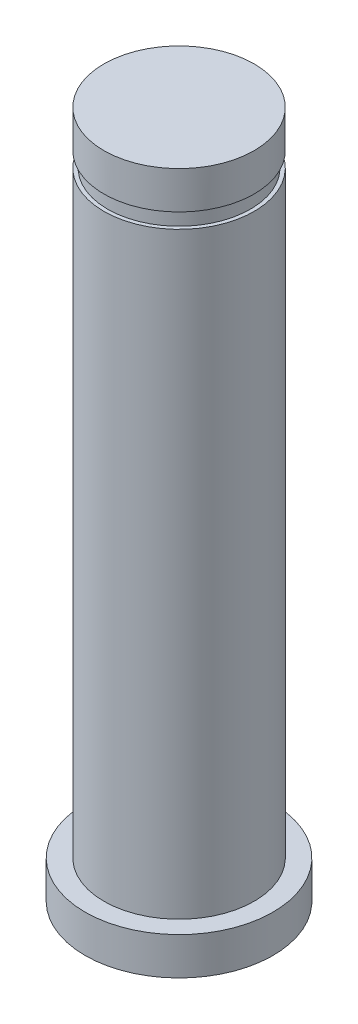
ISO-10303-21;
HEADER;
FILE_DESCRIPTION(('STEP AP214'),'2;1');
FILE_NAME('part.step','',(''),(''),'','','');
FILE_SCHEMA(('AUTOMOTIVE_DESIGN { 1 0 10303 214 1 1 1 1 }'));
ENDSEC;
DATA;
#1=APPLICATION_CONTEXT('core data for automotive mechanical design processes');
#2=APPLICATION_PROTOCOL_DEFINITION('international standard','automotive_design',2000,#1);
#3=PRODUCT_CONTEXT('',#1,'mechanical');
#4=PRODUCT('Part','Part','',(#3));
#5=PRODUCT_RELATED_PRODUCT_CATEGORY('part','',(#4));
#6=PRODUCT_DEFINITION_FORMATION('','',#4);
#7=PRODUCT_DEFINITION_CONTEXT('part definition',#1,'design');
#8=PRODUCT_DEFINITION('design','',#6,#7);
#9=PRODUCT_DEFINITION_SHAPE('','',#8);
#10=(LENGTH_UNIT() NAMED_UNIT(*) SI_UNIT(.MILLI.,.METRE.));
#11=(NAMED_UNIT(*) PLANE_ANGLE_UNIT() SI_UNIT($,.RADIAN.));
#12=(NAMED_UNIT(*) SI_UNIT($,.STERADIAN.) SOLID_ANGLE_UNIT());
#13=UNCERTAINTY_MEASURE_WITH_UNIT(LENGTH_MEASURE(1.E-05),#10,'distance_accuracy_value','');
#14=(GEOMETRIC_REPRESENTATION_CONTEXT(3) GLOBAL_UNCERTAINTY_ASSIGNED_CONTEXT((#13)) GLOBAL_UNIT_ASSIGNED_CONTEXT((#10,
#11,#12)) REPRESENTATION_CONTEXT('',''));
#15=CARTESIAN_POINT('',(0.,0.,0.));
#16=DIRECTION('',(0.,0.,1.));
#17=DIRECTION('',(1.,0.,0.));
#18=AXIS2_PLACEMENT_3D('',#15,#16,#17);
#19=CARTESIAN_POINT('',(0.,36.6,0.));
#20=DIRECTION('',(0.,-1.,0.));
#21=DIRECTION('',(0.,0.,-1.));
#22=AXIS2_PLACEMENT_3D('',#19,#20,#21);
#23=CYLINDRICAL_SURFACE('',#22,4.);
#24=CARTESIAN_POINT('',(0.,2.,0.));
#25=DIRECTION('',(0.,1.,0.));
#26=DIRECTION('',(0.,0.,1.));
#27=AXIS2_PLACEMENT_3D('',#24,#25,#26);
#28=CIRCLE('',#27,4.);
#29=CARTESIAN_POINT('',(0.,2.,4.));
#30=VERTEX_POINT('',#29);
#31=EDGE_CURVE('E10',#30,#30,#28,.T.);
#32=ORIENTED_EDGE('',*,*,#31,.T.);
#33=EDGE_LOOP('',(#32));
#34=FACE_BOUND('',#33,.T.);
#35=CARTESIAN_POINT('',(0.,33.8,0.));
#36=DIRECTION('',(0.,1.,0.));
#37=DIRECTION('',(0.,0.,1.));
#38=AXIS2_PLACEMENT_3D('',#35,#36,#37);
#39=CIRCLE('',#38,4.);
#40=CARTESIAN_POINT('',(0.,33.8,4.));
#41=VERTEX_POINT('',#40);
#42=EDGE_CURVE('E36',#41,#41,#39,.T.);
#43=ORIENTED_EDGE('',*,*,#42,.F.);
#44=EDGE_LOOP('',(#43));
#45=FACE_BOUND('',#44,.T.);
#46=ADVANCED_FACE('F32',(#34,#45),#23,.T.);
#47=CARTESIAN_POINT('',(0.,2.,0.));
#48=DIRECTION('',(0.,-1.,0.));
#49=DIRECTION('',(0.,0.,-1.));
#50=AXIS2_PLACEMENT_3D('',#47,#48,#49);
#51=CYLINDRICAL_SURFACE('',#50,5.);
#52=CARTESIAN_POINT('',(0.,2.,0.));
#53=DIRECTION('',(0.,1.,0.));
#54=DIRECTION('',(0.,0.,1.));
#55=AXIS2_PLACEMENT_3D('',#52,#53,#54);
#56=CIRCLE('',#55,5.);
#57=CARTESIAN_POINT('',(0.,2.,5.));
#58=VERTEX_POINT('',#57);
#59=EDGE_CURVE('E40',#58,#58,#56,.T.);
#60=ORIENTED_EDGE('',*,*,#59,.F.);
#61=EDGE_LOOP('',(#60));
#62=FACE_BOUND('',#61,.T.);
#63=CARTESIAN_POINT('',(0.,0.,0.));
#64=DIRECTION('',(0.,1.,0.));
#65=DIRECTION('',(0.,0.,1.));
#66=AXIS2_PLACEMENT_3D('',#63,#64,#65);
#67=CIRCLE('',#66,5.);
#68=CARTESIAN_POINT('',(0.,0.,5.));
#69=VERTEX_POINT('',#68);
#70=EDGE_CURVE('E45',#69,#69,#67,.T.);
#71=ORIENTED_EDGE('',*,*,#70,.T.);
#72=EDGE_LOOP('',(#71));
#73=FACE_BOUND('',#72,.T.);
#74=ADVANCED_FACE('F34',(#62,#73),#51,.T.);
#75=CARTESIAN_POINT('',(0.,2.,0.));
#76=DIRECTION('',(0.,1.,0.));
#77=DIRECTION('',(0.,0.,1.));
#78=AXIS2_PLACEMENT_3D('',#75,#76,#77);
#79=PLANE('',#78);
#80=ORIENTED_EDGE('',*,*,#31,.F.);
#81=EDGE_LOOP('',(#80));
#82=FACE_BOUND('',#81,.T.);
#83=ORIENTED_EDGE('',*,*,#59,.T.);
#84=EDGE_LOOP('',(#83));
#85=FACE_BOUND('',#84,.T.);
#86=ADVANCED_FACE('F87',(#82,#85),#79,.T.);
#87=CARTESIAN_POINT('',(0.,0.,0.));
#88=DIRECTION('',(0.,1.,0.));
#89=DIRECTION('',(0.,0.,1.));
#90=AXIS2_PLACEMENT_3D('',#87,#88,#89);
#91=PLANE('',#90);
#92=ORIENTED_EDGE('',*,*,#70,.F.);
#93=EDGE_LOOP('',(#92));
#94=FACE_BOUND('',#93,.T.);
#95=ADVANCED_FACE('F121',(#94),#91,.F.);
#96=CARTESIAN_POINT('',(3.8,33.8,0.));
#97=DIRECTION('',(0.,1.,0.));
#98=DIRECTION('',(0.,0.,1.));
#99=AXIS2_PLACEMENT_3D('',#96,#97,#98);
#100=PLANE('',#99);
#101=CARTESIAN_POINT('',(0.,33.8,0.));
#102=DIRECTION('',(0.,1.,0.));
#103=DIRECTION('',(0.,0.,1.));
#104=AXIS2_PLACEMENT_3D('',#101,#102,#103);
#105=CIRCLE('',#104,3.8);
#106=CARTESIAN_POINT('',(0.,33.8,3.8));
#107=VERTEX_POINT('',#106);
#108=EDGE_CURVE('E54',#107,#107,#105,.T.);
#109=ORIENTED_EDGE('',*,*,#108,.F.);
#110=EDGE_LOOP('',(#109));
#111=FACE_BOUND('',#110,.T.);
#112=ORIENTED_EDGE('',*,*,#42,.T.);
#113=EDGE_LOOP('',(#112));
#114=FACE_BOUND('',#113,.T.);
#115=ADVANCED_FACE('F79',(#111,#114),#100,.T.);
#116=CARTESIAN_POINT('',(3.8,34.6,0.));
#117=DIRECTION('',(0.,-1.,0.));
#118=DIRECTION('',(0.,0.,-1.));
#119=AXIS2_PLACEMENT_3D('',#116,#117,#118);
#120=PLANE('',#119);
#121=CARTESIAN_POINT('',(0.,34.6,0.));
#122=DIRECTION('',(0.,1.,0.));
#123=DIRECTION('',(0.,0.,1.));
#124=AXIS2_PLACEMENT_3D('',#121,#122,#123);
#125=CIRCLE('',#124,3.8);
#126=CARTESIAN_POINT('',(0.,34.6,3.8));
#127=VERTEX_POINT('',#126);
#128=EDGE_CURVE('E59',#127,#127,#125,.T.);
#129=ORIENTED_EDGE('',*,*,#128,.T.);
#130=EDGE_LOOP('',(#129));
#131=FACE_BOUND('',#130,.T.);
#132=CARTESIAN_POINT('',(0.,34.6,0.));
#133=DIRECTION('',(0.,-1.,0.));
#134=DIRECTION('',(0.,0.,-1.));
#135=AXIS2_PLACEMENT_3D('',#132,#133,#134);
#136=CIRCLE('',#135,4.);
#137=CARTESIAN_POINT('',(0.,34.6,-4.));
#138=VERTEX_POINT('',#137);
#139=EDGE_CURVE('E52',#138,#138,#136,.T.);
#140=ORIENTED_EDGE('',*,*,#139,.T.);
#141=EDGE_LOOP('',(#140));
#142=FACE_BOUND('',#141,.T.);
#143=ADVANCED_FACE('F66',(#131,#142),#120,.T.);
#144=CARTESIAN_POINT('',(0.,36.6,0.));
#145=DIRECTION('',(0.,1.,0.));
#146=DIRECTION('',(0.,0.,1.));
#147=AXIS2_PLACEMENT_3D('',#144,#145,#146);
#148=CYLINDRICAL_SURFACE('',#147,3.8);
#149=ORIENTED_EDGE('',*,*,#108,.T.);
#150=EDGE_LOOP('',(#149));
#151=FACE_BOUND('',#150,.T.);
#152=ORIENTED_EDGE('',*,*,#128,.F.);
#153=EDGE_LOOP('',(#152));
#154=FACE_BOUND('',#153,.T.);
#155=ADVANCED_FACE('F68',(#151,#154),#148,.T.);
#156=CARTESIAN_POINT('',(0.,36.6,0.));
#157=DIRECTION('',(0.,1.,0.));
#158=DIRECTION('',(0.,0.,1.));
#159=AXIS2_PLACEMENT_3D('',#156,#157,#158);
#160=PLANE('',#159);
#161=CARTESIAN_POINT('',(0.,36.6,0.));
#162=DIRECTION('',(0.,1.,0.));
#163=DIRECTION('',(0.,0.,1.));
#164=AXIS2_PLACEMENT_3D('',#161,#162,#163);
#165=CIRCLE('',#164,4.);
#166=CARTESIAN_POINT('',(0.,36.6,4.));
#167=VERTEX_POINT('',#166);
#168=EDGE_CURVE('E48',#167,#167,#165,.T.);
#169=ORIENTED_EDGE('',*,*,#168,.T.);
#170=EDGE_LOOP('',(#169));
#171=FACE_BOUND('',#170,.T.);
#172=ADVANCED_FACE('F70',(#171),#160,.T.);
#173=ORIENTED_EDGE('',*,*,#168,.F.);
#174=EDGE_LOOP('',(#173));
#175=FACE_BOUND('',#174,.T.);
#176=ORIENTED_EDGE('',*,*,#139,.F.);
#177=EDGE_LOOP('',(#176));
#178=FACE_BOUND('',#177,.T.);
#179=ADVANCED_FACE('F76',(#175,#178),#23,.T.);
#180=CLOSED_SHELL('',(#46,#74,#86,#95,#115,#143,#155,#172,#179));
#181=MANIFOLD_SOLID_BREP('B2',#180);
#182=ADVANCED_BREP_SHAPE_REPRESENTATION('',(#18,#181),#14);
#183=SHAPE_DEFINITION_REPRESENTATION(#9,#182);
ENDSEC;
END-ISO-10303-21;
